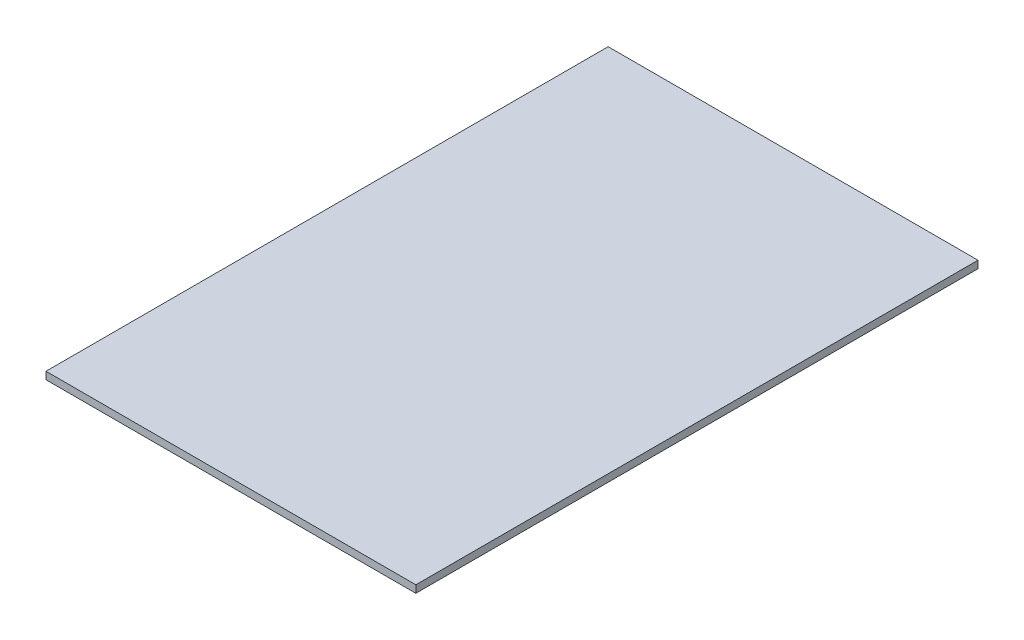
ISO-10303-21;
HEADER;
FILE_DESCRIPTION(('STEP AP214'),'2;1');
FILE_NAME('part.step','',(''),(''),'','','');
FILE_SCHEMA(('AUTOMOTIVE_DESIGN { 1 0 10303 214 1 1 1 1 }'));
ENDSEC;
DATA;
#1=APPLICATION_CONTEXT('core data for automotive mechanical design processes');
#2=APPLICATION_PROTOCOL_DEFINITION('international standard','automotive_design',2000,#1);
#3=PRODUCT_CONTEXT('',#1,'mechanical');
#4=PRODUCT('Part','Part','',(#3));
#5=PRODUCT_RELATED_PRODUCT_CATEGORY('part','',(#4));
#6=PRODUCT_DEFINITION_FORMATION('','',#4);
#7=PRODUCT_DEFINITION_CONTEXT('part definition',#1,'design');
#8=PRODUCT_DEFINITION('design','',#6,#7);
#9=PRODUCT_DEFINITION_SHAPE('','',#8);
#10=(LENGTH_UNIT() NAMED_UNIT(*) SI_UNIT(.MILLI.,.METRE.));
#11=(NAMED_UNIT(*) PLANE_ANGLE_UNIT() SI_UNIT($,.RADIAN.));
#12=(NAMED_UNIT(*) SI_UNIT($,.STERADIAN.) SOLID_ANGLE_UNIT());
#13=UNCERTAINTY_MEASURE_WITH_UNIT(LENGTH_MEASURE(1.E-05),#10,'distance_accuracy_value','');
#14=(GEOMETRIC_REPRESENTATION_CONTEXT(3) GLOBAL_UNCERTAINTY_ASSIGNED_CONTEXT((#13)) GLOBAL_UNIT_ASSIGNED_CONTEXT((#10,
#11,#12)) REPRESENTATION_CONTEXT('',''));
#15=CARTESIAN_POINT('',(0.,0.,0.));
#16=DIRECTION('',(0.,0.,1.));
#17=DIRECTION('',(1.,0.,0.));
#18=AXIS2_PLACEMENT_3D('',#15,#16,#17);
#19=CARTESIAN_POINT('',(158.75,6.35,241.3));
#20=DIRECTION('',(-1.,0.,0.));
#21=DIRECTION('',(0.,0.,1.));
#22=AXIS2_PLACEMENT_3D('',#19,#20,#21);
#23=PLANE('',#22);
#24=DIRECTION('',(0.,0.,-1.));
#25=VECTOR('',#24,1.);
#26=CARTESIAN_POINT('',(158.75,0.,241.3));
#27=LINE('',#26,#25);
#28=CARTESIAN_POINT('',(158.75,0.,241.3));
#29=VERTEX_POINT('',#28);
#30=CARTESIAN_POINT('',(158.75,0.,-241.3));
#31=VERTEX_POINT('',#30);
#32=EDGE_CURVE('E113',#29,#31,#27,.T.);
#33=ORIENTED_EDGE('',*,*,#32,.T.);
#34=DIRECTION('',(0.,-1.,0.));
#35=VECTOR('',#34,1.);
#36=CARTESIAN_POINT('',(158.75,6.35,-241.3));
#37=LINE('',#36,#35);
#38=CARTESIAN_POINT('',(158.75,6.35,-241.3));
#39=VERTEX_POINT('',#38);
#40=EDGE_CURVE('E11',#39,#31,#37,.T.);
#41=ORIENTED_EDGE('',*,*,#40,.F.);
#42=DIRECTION('',(0.,0.,-1.));
#43=VECTOR('',#42,1.);
#44=CARTESIAN_POINT('',(158.75,6.35,241.3));
#45=LINE('',#44,#43);
#46=CARTESIAN_POINT('',(158.75,6.35,241.3));
#47=VERTEX_POINT('',#46);
#48=EDGE_CURVE('E97',#47,#39,#45,.T.);
#49=ORIENTED_EDGE('',*,*,#48,.F.);
#50=DIRECTION('',(0.,-1.,0.));
#51=VECTOR('',#50,1.);
#52=CARTESIAN_POINT('',(158.75,6.35,241.3));
#53=LINE('',#52,#51);
#54=EDGE_CURVE('E109',#47,#29,#53,.T.);
#55=ORIENTED_EDGE('',*,*,#54,.T.);
#56=EDGE_LOOP('',(#33,#41,#49,#55));
#57=FACE_BOUND('',#56,.T.);
#58=ADVANCED_FACE('F45',(#57),#23,.F.);
#59=CARTESIAN_POINT('',(-158.75,6.35,-241.3));
#60=DIRECTION('',(0.,0.,1.));
#61=DIRECTION('',(1.,0.,0.));
#62=AXIS2_PLACEMENT_3D('',#59,#60,#61);
#63=PLANE('',#62);
#64=DIRECTION('',(-1.,0.,0.));
#65=VECTOR('',#64,1.);
#66=CARTESIAN_POINT('',(-158.75,0.,-241.3));
#67=LINE('',#66,#65);
#68=CARTESIAN_POINT('',(-158.75,0.,-241.3));
#69=VERTEX_POINT('',#68);
#70=EDGE_CURVE('E102',#31,#69,#67,.T.);
#71=ORIENTED_EDGE('',*,*,#70,.T.);
#72=DIRECTION('',(0.,-1.,0.));
#73=VECTOR('',#72,1.);
#74=CARTESIAN_POINT('',(-158.75,6.35,-241.3));
#75=LINE('',#74,#73);
#76=CARTESIAN_POINT('',(-158.75,6.35,-241.3));
#77=VERTEX_POINT('',#76);
#78=EDGE_CURVE('E54',#77,#69,#75,.T.);
#79=ORIENTED_EDGE('',*,*,#78,.F.);
#80=DIRECTION('',(-1.,0.,0.));
#81=VECTOR('',#80,1.);
#82=CARTESIAN_POINT('',(-158.75,6.35,-241.3));
#83=LINE('',#82,#81);
#84=EDGE_CURVE('E92',#39,#77,#83,.T.);
#85=ORIENTED_EDGE('',*,*,#84,.F.);
#86=ORIENTED_EDGE('',*,*,#40,.T.);
#87=EDGE_LOOP('',(#71,#79,#85,#86));
#88=FACE_BOUND('',#87,.T.);
#89=ADVANCED_FACE('F101',(#88),#63,.F.);
#90=CARTESIAN_POINT('',(-158.75,6.35,241.3));
#91=DIRECTION('',(1.,0.,0.));
#92=DIRECTION('',(0.,0.,-1.));
#93=AXIS2_PLACEMENT_3D('',#90,#91,#92);
#94=PLANE('',#93);
#95=DIRECTION('',(0.,0.,1.));
#96=VECTOR('',#95,1.);
#97=CARTESIAN_POINT('',(-158.75,0.,241.3));
#98=LINE('',#97,#96);
#99=CARTESIAN_POINT('',(-158.75,0.,241.3));
#100=VERTEX_POINT('',#99);
#101=EDGE_CURVE('E79',#69,#100,#98,.T.);
#102=ORIENTED_EDGE('',*,*,#101,.T.);
#103=DIRECTION('',(0.,-1.,0.));
#104=VECTOR('',#103,1.);
#105=CARTESIAN_POINT('',(-158.75,6.35,241.3));
#106=LINE('',#105,#104);
#107=CARTESIAN_POINT('',(-158.75,6.35,241.3));
#108=VERTEX_POINT('',#107);
#109=EDGE_CURVE('E104',#108,#100,#106,.T.);
#110=ORIENTED_EDGE('',*,*,#109,.F.);
#111=DIRECTION('',(0.,0.,1.));
#112=VECTOR('',#111,1.);
#113=CARTESIAN_POINT('',(-158.75,6.35,241.3));
#114=LINE('',#113,#112);
#115=EDGE_CURVE('E95',#77,#108,#114,.T.);
#116=ORIENTED_EDGE('',*,*,#115,.F.);
#117=ORIENTED_EDGE('',*,*,#78,.T.);
#118=EDGE_LOOP('',(#102,#110,#116,#117));
#119=FACE_BOUND('',#118,.T.);
#120=ADVANCED_FACE('F105',(#119),#94,.F.);
#121=CARTESIAN_POINT('',(-158.75,6.35,241.3));
#122=DIRECTION('',(0.,0.,-1.));
#123=DIRECTION('',(-1.,0.,0.));
#124=AXIS2_PLACEMENT_3D('',#121,#122,#123);
#125=PLANE('',#124);
#126=DIRECTION('',(1.,0.,0.));
#127=VECTOR('',#126,1.);
#128=CARTESIAN_POINT('',(-158.75,0.,241.3));
#129=LINE('',#128,#127);
#130=EDGE_CURVE('E85',#100,#29,#129,.T.);
#131=ORIENTED_EDGE('',*,*,#130,.T.);
#132=ORIENTED_EDGE('',*,*,#54,.F.);
#133=DIRECTION('',(1.,0.,0.));
#134=VECTOR('',#133,1.);
#135=CARTESIAN_POINT('',(-158.75,6.35,241.3));
#136=LINE('',#135,#134);
#137=EDGE_CURVE('E62',#108,#47,#136,.T.);
#138=ORIENTED_EDGE('',*,*,#137,.F.);
#139=ORIENTED_EDGE('',*,*,#109,.T.);
#140=EDGE_LOOP('',(#131,#132,#138,#139));
#141=FACE_BOUND('',#140,.T.);
#142=ADVANCED_FACE('F126',(#141),#125,.F.);
#143=CARTESIAN_POINT('',(0.,6.35,0.));
#144=DIRECTION('',(0.,-1.,0.));
#145=DIRECTION('',(0.,0.,-1.));
#146=AXIS2_PLACEMENT_3D('',#143,#144,#145);
#147=PLANE('',#146);
#148=ORIENTED_EDGE('',*,*,#48,.T.);
#149=ORIENTED_EDGE('',*,*,#84,.T.);
#150=ORIENTED_EDGE('',*,*,#115,.T.);
#151=ORIENTED_EDGE('',*,*,#137,.T.);
#152=EDGE_LOOP('',(#148,#149,#150,#151));
#153=FACE_BOUND('',#152,.T.);
#154=ADVANCED_FACE('F93',(#153),#147,.F.);
#155=CARTESIAN_POINT('',(0.,0.,0.));
#156=DIRECTION('',(0.,-1.,0.));
#157=DIRECTION('',(0.,0.,-1.));
#158=AXIS2_PLACEMENT_3D('',#155,#156,#157);
#159=PLANE('',#158);
#160=ORIENTED_EDGE('',*,*,#32,.F.);
#161=ORIENTED_EDGE('',*,*,#130,.F.);
#162=ORIENTED_EDGE('',*,*,#101,.F.);
#163=ORIENTED_EDGE('',*,*,#70,.F.);
#164=EDGE_LOOP('',(#160,#161,#162,#163));
#165=FACE_BOUND('',#164,.T.);
#166=ADVANCED_FACE('F129',(#165),#159,.T.);
#167=CLOSED_SHELL('',(#58,#89,#120,#142,#154,#166));
#168=MANIFOLD_SOLID_BREP('B2',#167);
#169=ADVANCED_BREP_SHAPE_REPRESENTATION('',(#18,#168),#14);
#170=SHAPE_DEFINITION_REPRESENTATION(#9,#169);
ENDSEC;
END-ISO-10303-21;
